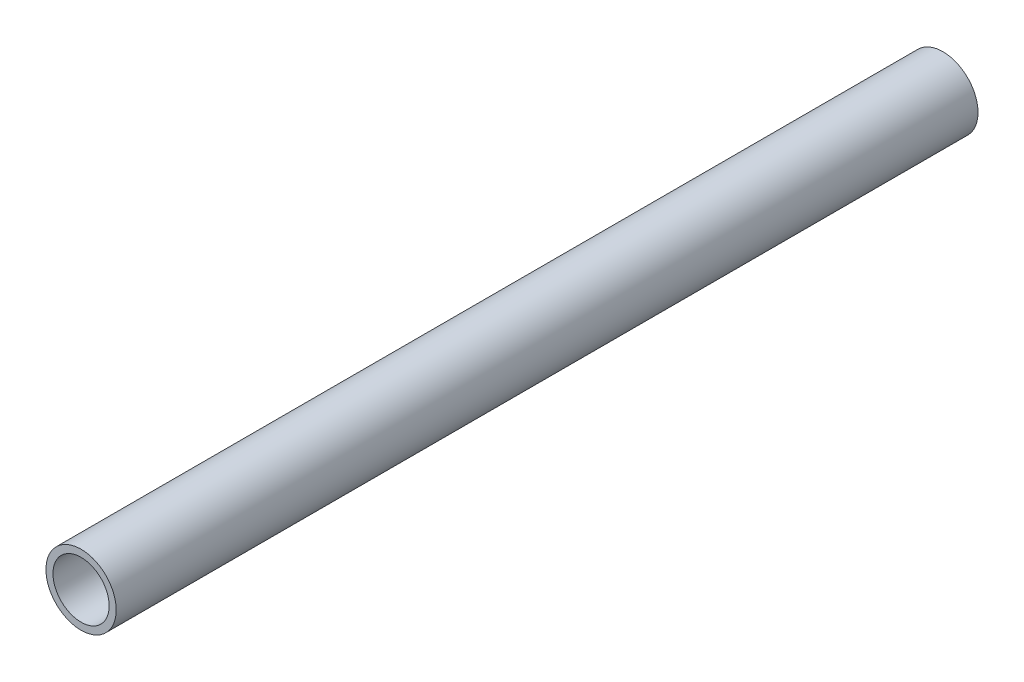
ISO-10303-21;
HEADER;
FILE_DESCRIPTION(('STEP AP214'),'2;1');
FILE_NAME('part.step','',(''),(''),'','','');
FILE_SCHEMA(('AUTOMOTIVE_DESIGN { 1 0 10303 214 1 1 1 1 }'));
ENDSEC;
DATA;
#1=APPLICATION_CONTEXT('core data for automotive mechanical design processes');
#2=APPLICATION_PROTOCOL_DEFINITION('international standard','automotive_design',2000,#1);
#3=PRODUCT_CONTEXT('',#1,'mechanical');
#4=PRODUCT('Part','Part','',(#3));
#5=PRODUCT_RELATED_PRODUCT_CATEGORY('part','',(#4));
#6=PRODUCT_DEFINITION_FORMATION('','',#4);
#7=PRODUCT_DEFINITION_CONTEXT('part definition',#1,'design');
#8=PRODUCT_DEFINITION('design','',#6,#7);
#9=PRODUCT_DEFINITION_SHAPE('','',#8);
#10=(LENGTH_UNIT() NAMED_UNIT(*) SI_UNIT(.MILLI.,.METRE.));
#11=(NAMED_UNIT(*) PLANE_ANGLE_UNIT() SI_UNIT($,.RADIAN.));
#12=(NAMED_UNIT(*) SI_UNIT($,.STERADIAN.) SOLID_ANGLE_UNIT());
#13=UNCERTAINTY_MEASURE_WITH_UNIT(LENGTH_MEASURE(1.E-05),#10,'distance_accuracy_value','');
#14=(GEOMETRIC_REPRESENTATION_CONTEXT(3) GLOBAL_UNCERTAINTY_ASSIGNED_CONTEXT((#13)) GLOBAL_UNIT_ASSIGNED_CONTEXT((#10,
#11,#12)) REPRESENTATION_CONTEXT('',''));
#15=CARTESIAN_POINT('',(0.,0.,0.));
#16=DIRECTION('',(0.,0.,1.));
#17=DIRECTION('',(1.,0.,0.));
#18=AXIS2_PLACEMENT_3D('',#15,#16,#17);
#19=CARTESIAN_POINT('',(0.,0.,92.));
#20=DIRECTION('',(0.,0.,-1.));
#21=DIRECTION('',(-1.,0.,0.));
#22=AXIS2_PLACEMENT_3D('',#19,#20,#21);
#23=CYLINDRICAL_SURFACE('',#22,7.5);
#24=CARTESIAN_POINT('',(0.,0.,92.));
#25=DIRECTION('',(0.,0.,1.));
#26=DIRECTION('',(1.,0.,0.));
#27=AXIS2_PLACEMENT_3D('',#24,#25,#26);
#28=CIRCLE('',#27,7.5);
#29=CARTESIAN_POINT('',(7.5,0.,92.));
#30=VERTEX_POINT('',#29);
#31=EDGE_CURVE('E10',#30,#30,#28,.T.);
#32=ORIENTED_EDGE('',*,*,#31,.F.);
#33=EDGE_LOOP('',(#32));
#34=FACE_BOUND('',#33,.T.);
#35=CARTESIAN_POINT('',(0.,0.,-92.));
#36=DIRECTION('',(0.,0.,1.));
#37=DIRECTION('',(1.,0.,0.));
#38=AXIS2_PLACEMENT_3D('',#35,#36,#37);
#39=CIRCLE('',#38,7.5);
#40=CARTESIAN_POINT('',(7.5,0.,-92.));
#41=VERTEX_POINT('',#40);
#42=EDGE_CURVE('E34',#41,#41,#39,.T.);
#43=ORIENTED_EDGE('',*,*,#42,.T.);
#44=EDGE_LOOP('',(#43));
#45=FACE_BOUND('',#44,.T.);
#46=ADVANCED_FACE('F31',(#34,#45),#23,.T.);
#47=CARTESIAN_POINT('',(0.,0.,92.));
#48=DIRECTION('',(0.,0.,1.));
#49=DIRECTION('',(1.,0.,0.));
#50=AXIS2_PLACEMENT_3D('',#47,#48,#49);
#51=PLANE('',#50);
#52=CARTESIAN_POINT('',(0.,0.,92.));
#53=DIRECTION('',(0.,0.,1.));
#54=DIRECTION('',(1.,0.,0.));
#55=AXIS2_PLACEMENT_3D('',#52,#53,#54);
#56=CIRCLE('',#55,6.);
#57=CARTESIAN_POINT('',(6.,0.,92.));
#58=VERTEX_POINT('',#57);
#59=EDGE_CURVE('E43',#58,#58,#56,.T.);
#60=ORIENTED_EDGE('',*,*,#59,.F.);
#61=EDGE_LOOP('',(#60));
#62=FACE_BOUND('',#61,.T.);
#63=ORIENTED_EDGE('',*,*,#31,.T.);
#64=EDGE_LOOP('',(#63));
#65=FACE_BOUND('',#64,.T.);
#66=ADVANCED_FACE('F68',(#62,#65),#51,.T.);
#67=CARTESIAN_POINT('',(0.,0.,-92.));
#68=DIRECTION('',(0.,0.,1.));
#69=DIRECTION('',(1.,0.,0.));
#70=AXIS2_PLACEMENT_3D('',#67,#68,#69);
#71=PLANE('',#70);
#72=CARTESIAN_POINT('',(0.,0.,-92.));
#73=DIRECTION('',(0.,0.,-1.));
#74=DIRECTION('',(-1.,0.,0.));
#75=AXIS2_PLACEMENT_3D('',#72,#73,#74);
#76=CIRCLE('',#75,6.);
#77=CARTESIAN_POINT('',(-6.,0.,-92.));
#78=VERTEX_POINT('',#77);
#79=EDGE_CURVE('E49',#78,#78,#76,.T.);
#80=ORIENTED_EDGE('',*,*,#79,.F.);
#81=EDGE_LOOP('',(#80));
#82=FACE_BOUND('',#81,.T.);
#83=ORIENTED_EDGE('',*,*,#42,.F.);
#84=EDGE_LOOP('',(#83));
#85=FACE_BOUND('',#84,.T.);
#86=ADVANCED_FACE('F64',(#82,#85),#71,.F.);
#87=CARTESIAN_POINT('',(0.,0.,57.41));
#88=DIRECTION('',(0.,0.,1.));
#89=DIRECTION('',(1.,0.,0.));
#90=AXIS2_PLACEMENT_3D('',#87,#88,#89);
#91=CYLINDRICAL_SURFACE('',#90,6.);
#92=CARTESIAN_POINT('',(0.,0.,57.41));
#93=DIRECTION('',(0.,0.,1.));
#94=DIRECTION('',(1.,0.,0.));
#95=AXIS2_PLACEMENT_3D('',#92,#93,#94);
#96=CIRCLE('',#95,6.);
#97=CARTESIAN_POINT('',(6.,0.,57.41));
#98=VERTEX_POINT('',#97);
#99=EDGE_CURVE('E41',#98,#98,#96,.T.);
#100=ORIENTED_EDGE('',*,*,#99,.F.);
#101=EDGE_LOOP('',(#100));
#102=FACE_BOUND('',#101,.T.);
#103=ORIENTED_EDGE('',*,*,#59,.T.);
#104=EDGE_LOOP('',(#103));
#105=FACE_BOUND('',#104,.T.);
#106=ADVANCED_FACE('F67',(#102,#105),#91,.F.);
#107=CARTESIAN_POINT('',(0.,0.,57.41));
#108=DIRECTION('',(0.,0.,1.));
#109=DIRECTION('',(1.,0.,0.));
#110=AXIS2_PLACEMENT_3D('',#107,#108,#109);
#111=PLANE('',#110);
#112=ORIENTED_EDGE('',*,*,#99,.T.);
#113=EDGE_LOOP('',(#112));
#114=FACE_BOUND('',#113,.T.);
#115=ADVANCED_FACE('F60',(#114),#111,.T.);
#116=CARTESIAN_POINT('',(0.,0.,-57.41));
#117=DIRECTION('',(0.,0.,-1.));
#118=DIRECTION('',(-1.,0.,0.));
#119=AXIS2_PLACEMENT_3D('',#116,#117,#118);
#120=CYLINDRICAL_SURFACE('',#119,6.);
#121=CARTESIAN_POINT('',(0.,0.,-57.41));
#122=DIRECTION('',(0.,0.,-1.));
#123=DIRECTION('',(-1.,0.,0.));
#124=AXIS2_PLACEMENT_3D('',#121,#122,#123);
#125=CIRCLE('',#124,6.);
#126=CARTESIAN_POINT('',(-6.,0.,-57.41));
#127=VERTEX_POINT('',#126);
#128=EDGE_CURVE('E46',#127,#127,#125,.T.);
#129=ORIENTED_EDGE('',*,*,#128,.F.);
#130=EDGE_LOOP('',(#129));
#131=FACE_BOUND('',#130,.T.);
#132=ORIENTED_EDGE('',*,*,#79,.T.);
#133=EDGE_LOOP('',(#132));
#134=FACE_BOUND('',#133,.T.);
#135=ADVANCED_FACE('F57',(#131,#134),#120,.F.);
#136=CARTESIAN_POINT('',(0.,0.,-57.41));
#137=DIRECTION('',(0.,0.,-1.));
#138=DIRECTION('',(-1.,0.,0.));
#139=AXIS2_PLACEMENT_3D('',#136,#137,#138);
#140=PLANE('',#139);
#141=ORIENTED_EDGE('',*,*,#128,.T.);
#142=EDGE_LOOP('',(#141));
#143=FACE_BOUND('',#142,.T.);
#144=ADVANCED_FACE('F55',(#143),#140,.T.);
#145=CLOSED_SHELL('',(#46,#66,#86,#106,#115,#135,#144));
#146=MANIFOLD_SOLID_BREP('B2',#145);
#147=ADVANCED_BREP_SHAPE_REPRESENTATION('',(#18,#146),#14);
#148=SHAPE_DEFINITION_REPRESENTATION(#9,#147);
ENDSEC;
END-ISO-10303-21;
